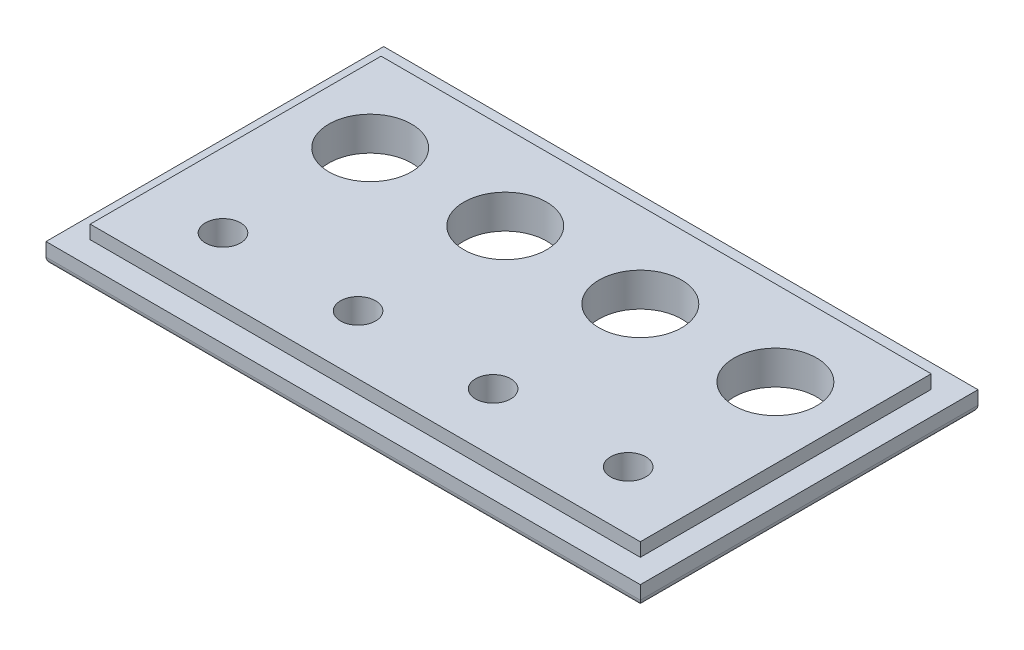
ISO-10303-21;
HEADER;
FILE_DESCRIPTION(('STEP AP214'),'2;1');
FILE_NAME('part.step','',(''),(''),'','','');
FILE_SCHEMA(('AUTOMOTIVE_DESIGN { 1 0 10303 214 1 1 1 1 }'));
ENDSEC;
DATA;
#1=APPLICATION_CONTEXT('core data for automotive mechanical design processes');
#2=APPLICATION_PROTOCOL_DEFINITION('international standard','automotive_design',2000,#1);
#3=PRODUCT_CONTEXT('',#1,'mechanical');
#4=PRODUCT('Part','Part','',(#3));
#5=PRODUCT_RELATED_PRODUCT_CATEGORY('part','',(#4));
#6=PRODUCT_DEFINITION_FORMATION('','',#4);
#7=PRODUCT_DEFINITION_CONTEXT('part definition',#1,'design');
#8=PRODUCT_DEFINITION('design','',#6,#7);
#9=PRODUCT_DEFINITION_SHAPE('','',#8);
#10=(LENGTH_UNIT() NAMED_UNIT(*) SI_UNIT(.MILLI.,.METRE.));
#11=(NAMED_UNIT(*) PLANE_ANGLE_UNIT() SI_UNIT($,.RADIAN.));
#12=(NAMED_UNIT(*) SI_UNIT($,.STERADIAN.) SOLID_ANGLE_UNIT());
#13=UNCERTAINTY_MEASURE_WITH_UNIT(LENGTH_MEASURE(1.E-05),#10,'distance_accuracy_value','');
#14=(GEOMETRIC_REPRESENTATION_CONTEXT(3) GLOBAL_UNCERTAINTY_ASSIGNED_CONTEXT((#13)) GLOBAL_UNIT_ASSIGNED_CONTEXT((#10,
#11,#12)) REPRESENTATION_CONTEXT('',''));
#15=CARTESIAN_POINT('',(0.,0.,0.));
#16=DIRECTION('',(0.,0.,1.));
#17=DIRECTION('',(1.,0.,0.));
#18=AXIS2_PLACEMENT_3D('',#15,#16,#17);
#19=CARTESIAN_POINT('',(44.,3.,0.));
#20=DIRECTION('',(1.,0.,0.));
#21=DIRECTION('',(0.,0.,-1.));
#22=AXIS2_PLACEMENT_3D('',#19,#20,#21);
#23=PLANE('',#22);
#24=DIRECTION('',(0.,-1.,0.));
#25=VECTOR('',#24,1.);
#26=CARTESIAN_POINT('',(44.,3.,0.));
#27=LINE('',#26,#25);
#28=CARTESIAN_POINT('',(44.,3.,0.));
#29=VERTEX_POINT('',#28);
#30=CARTESIAN_POINT('',(44.,1.,0.));
#31=VERTEX_POINT('',#30);
#32=EDGE_CURVE('E174',#29,#31,#27,.T.);
#33=ORIENTED_EDGE('',*,*,#32,.T.);
#34=DIRECTION('',(0.,0.,1.));
#35=VECTOR('',#34,1.);
#36=CARTESIAN_POINT('',(44.,1.,-50.));
#37=LINE('',#36,#35);
#38=CARTESIAN_POINT('',(44.,1.,-50.));
#39=VERTEX_POINT('',#38);
#40=EDGE_CURVE('E72',#31,#39,#37,.F.);
#41=ORIENTED_EDGE('',*,*,#40,.T.);
#42=DIRECTION('',(0.,-1.,0.));
#43=VECTOR('',#42,1.);
#44=CARTESIAN_POINT('',(44.,3.,-50.));
#45=LINE('',#44,#43);
#46=CARTESIAN_POINT('',(44.,3.,-50.));
#47=VERTEX_POINT('',#46);
#48=EDGE_CURVE('E184',#47,#39,#45,.T.);
#49=ORIENTED_EDGE('',*,*,#48,.F.);
#50=DIRECTION('',(0.,0.,1.));
#51=VECTOR('',#50,1.);
#52=CARTESIAN_POINT('',(44.,3.,0.));
#53=LINE('',#52,#51);
#54=EDGE_CURVE('E154',#47,#29,#53,.T.);
#55=ORIENTED_EDGE('',*,*,#54,.T.);
#56=EDGE_LOOP('',(#33,#41,#49,#55));
#57=FACE_BOUND('',#56,.T.);
#58=ADVANCED_FACE('F47',(#57),#23,.T.);
#59=CARTESIAN_POINT('',(0.,3.,-50.));
#60=DIRECTION('',(0.,0.,-1.));
#61=DIRECTION('',(-1.,0.,0.));
#62=AXIS2_PLACEMENT_3D('',#59,#60,#61);
#63=PLANE('',#62);
#64=ORIENTED_EDGE('',*,*,#48,.T.);
#65=DIRECTION('',(1.,0.,0.));
#66=VECTOR('',#65,1.);
#67=CARTESIAN_POINT('',(-44.,1.,-50.));
#68=LINE('',#67,#66);
#69=CARTESIAN_POINT('',(-44.,1.,-50.));
#70=VERTEX_POINT('',#69);
#71=EDGE_CURVE('E57',#39,#70,#68,.F.);
#72=ORIENTED_EDGE('',*,*,#71,.T.);
#73=DIRECTION('',(0.,-1.,0.));
#74=VECTOR('',#73,1.);
#75=CARTESIAN_POINT('',(-44.,3.,-50.));
#76=LINE('',#75,#74);
#77=CARTESIAN_POINT('',(-44.,3.,-50.));
#78=VERTEX_POINT('',#77);
#79=EDGE_CURVE('E181',#78,#70,#76,.T.);
#80=ORIENTED_EDGE('',*,*,#79,.F.);
#81=DIRECTION('',(1.,0.,0.));
#82=VECTOR('',#81,1.);
#83=CARTESIAN_POINT('',(0.,3.,-50.));
#84=LINE('',#83,#82);
#85=EDGE_CURVE('E159',#78,#47,#84,.T.);
#86=ORIENTED_EDGE('',*,*,#85,.T.);
#87=EDGE_LOOP('',(#64,#72,#80,#86));
#88=FACE_BOUND('',#87,.T.);
#89=ADVANCED_FACE('F317',(#88),#63,.T.);
#90=CARTESIAN_POINT('',(-44.,3.,0.));
#91=DIRECTION('',(1.,0.,0.));
#92=DIRECTION('',(0.,0.,-1.));
#93=AXIS2_PLACEMENT_3D('',#90,#91,#92);
#94=PLANE('',#93);
#95=ORIENTED_EDGE('',*,*,#79,.T.);
#96=DIRECTION('',(0.,0.,1.));
#97=VECTOR('',#96,1.);
#98=CARTESIAN_POINT('',(-44.,1.,0.));
#99=LINE('',#98,#97);
#100=CARTESIAN_POINT('',(-44.,1.,0.));
#101=VERTEX_POINT('',#100);
#102=EDGE_CURVE('E11',#70,#101,#99,.T.);
#103=ORIENTED_EDGE('',*,*,#102,.T.);
#104=DIRECTION('',(0.,-1.,0.));
#105=VECTOR('',#104,1.);
#106=CARTESIAN_POINT('',(-44.,3.,0.));
#107=LINE('',#106,#105);
#108=CARTESIAN_POINT('',(-44.,3.,0.));
#109=VERTEX_POINT('',#108);
#110=EDGE_CURVE('E177',#109,#101,#107,.T.);
#111=ORIENTED_EDGE('',*,*,#110,.F.);
#112=DIRECTION('',(0.,0.,1.));
#113=VECTOR('',#112,1.);
#114=CARTESIAN_POINT('',(-44.,3.,0.));
#115=LINE('',#114,#113);
#116=EDGE_CURVE('E168',#78,#109,#115,.T.);
#117=ORIENTED_EDGE('',*,*,#116,.F.);
#118=EDGE_LOOP('',(#95,#103,#111,#117));
#119=FACE_BOUND('',#118,.T.);
#120=ADVANCED_FACE('F321',(#119),#94,.F.);
#121=CARTESIAN_POINT('',(0.,3.,0.));
#122=DIRECTION('',(0.,0.,-1.));
#123=DIRECTION('',(-1.,0.,0.));
#124=AXIS2_PLACEMENT_3D('',#121,#122,#123);
#125=PLANE('',#124);
#126=ORIENTED_EDGE('',*,*,#110,.T.);
#127=DIRECTION('',(1.,0.,0.));
#128=VECTOR('',#127,1.);
#129=CARTESIAN_POINT('',(0.,1.,0.));
#130=LINE('',#129,#128);
#131=EDGE_CURVE('E187',#101,#31,#130,.T.);
#132=ORIENTED_EDGE('',*,*,#131,.T.);
#133=ORIENTED_EDGE('',*,*,#32,.F.);
#134=DIRECTION('',(1.,0.,0.));
#135=VECTOR('',#134,1.);
#136=CARTESIAN_POINT('',(0.,3.,0.));
#137=LINE('',#136,#135);
#138=EDGE_CURVE('E171',#109,#29,#137,.T.);
#139=ORIENTED_EDGE('',*,*,#138,.F.);
#140=EDGE_LOOP('',(#126,#132,#133,#139));
#141=FACE_BOUND('',#140,.T.);
#142=ADVANCED_FACE('F311',(#141),#125,.F.);
#143=CARTESIAN_POINT('',(0.,3.,0.));
#144=DIRECTION('',(0.,1.,0.));
#145=DIRECTION('',(0.,0.,1.));
#146=AXIS2_PLACEMENT_3D('',#143,#144,#145);
#147=PLANE('',#146);
#148=DIRECTION('',(0.,0.,-1.));
#149=VECTOR('',#148,1.);
#150=CARTESIAN_POINT('',(40.5,3.,-46.573471676949));
#151=LINE('',#150,#149);
#152=CARTESIAN_POINT('',(40.5,3.,-3.5));
#153=VERTEX_POINT('',#152);
#154=CARTESIAN_POINT('',(40.5,3.,-46.573471676949));
#155=VERTEX_POINT('',#154);
#156=EDGE_CURVE('E152',#153,#155,#151,.T.);
#157=ORIENTED_EDGE('',*,*,#156,.F.);
#158=DIRECTION('',(1.,0.,0.));
#159=VECTOR('',#158,1.);
#160=CARTESIAN_POINT('',(-40.9566130261587,3.,-3.5));
#161=LINE('',#160,#159);
#162=CARTESIAN_POINT('',(-40.9566130261587,3.,-3.5));
#163=VERTEX_POINT('',#162);
#164=EDGE_CURVE('E149',#163,#153,#161,.T.);
#165=ORIENTED_EDGE('',*,*,#164,.F.);
#166=DIRECTION('',(0.,0.,1.));
#167=VECTOR('',#166,1.);
#168=CARTESIAN_POINT('',(-40.9566130261587,3.,-46.573471676949));
#169=LINE('',#168,#167);
#170=CARTESIAN_POINT('',(-40.9566130261587,3.,-46.573471676949));
#171=VERTEX_POINT('',#170);
#172=EDGE_CURVE('E291',#171,#163,#169,.T.);
#173=ORIENTED_EDGE('',*,*,#172,.F.);
#174=DIRECTION('',(-1.,0.,0.));
#175=VECTOR('',#174,1.);
#176=CARTESIAN_POINT('',(-40.9566130261587,3.,-46.573471676949));
#177=LINE('',#176,#175);
#178=EDGE_CURVE('E288',#155,#171,#177,.T.);
#179=ORIENTED_EDGE('',*,*,#178,.F.);
#180=EDGE_LOOP('',(#157,#165,#173,#179));
#181=FACE_BOUND('',#180,.T.);
#182=ORIENTED_EDGE('',*,*,#54,.F.);
#183=ORIENTED_EDGE('',*,*,#85,.F.);
#184=ORIENTED_EDGE('',*,*,#116,.T.);
#185=ORIENTED_EDGE('',*,*,#138,.T.);
#186=EDGE_LOOP('',(#182,#183,#184,#185));
#187=FACE_BOUND('',#186,.T.);
#188=ADVANCED_FACE('F307',(#181,#187),#147,.T.);
#189=CARTESIAN_POINT('',(0.,0.,0.));
#190=DIRECTION('',(0.,1.,0.));
#191=DIRECTION('',(0.,0.,1.));
#192=AXIS2_PLACEMENT_3D('',#189,#190,#191);
#193=PLANE('',#192);
#194=DIRECTION('',(0.,0.,1.));
#195=VECTOR('',#194,1.);
#196=CARTESIAN_POINT('',(43.,0.,0.));
#197=LINE('',#196,#195);
#198=CARTESIAN_POINT('',(43.,0.,-49.));
#199=VERTEX_POINT('',#198);
#200=CARTESIAN_POINT('',(43.,0.,-1.));
#201=VERTEX_POINT('',#200);
#202=EDGE_CURVE('E197',#199,#201,#197,.T.);
#203=ORIENTED_EDGE('',*,*,#202,.T.);
#204=DIRECTION('',(1.,0.,0.));
#205=VECTOR('',#204,1.);
#206=CARTESIAN_POINT('',(0.,0.,-1.));
#207=LINE('',#206,#205);
#208=CARTESIAN_POINT('',(-43.,0.,-1.));
#209=VERTEX_POINT('',#208);
#210=EDGE_CURVE('E200',#201,#209,#207,.F.);
#211=ORIENTED_EDGE('',*,*,#210,.T.);
#212=DIRECTION('',(0.,0.,1.));
#213=VECTOR('',#212,1.);
#214=CARTESIAN_POINT('',(-43.,0.,0.));
#215=LINE('',#214,#213);
#216=CARTESIAN_POINT('',(-43.,0.,-49.));
#217=VERTEX_POINT('',#216);
#218=EDGE_CURVE('E191',#209,#217,#215,.F.);
#219=ORIENTED_EDGE('',*,*,#218,.T.);
#220=DIRECTION('',(1.,0.,0.));
#221=VECTOR('',#220,1.);
#222=CARTESIAN_POINT('',(44.,0.,-49.));
#223=LINE('',#222,#221);
#224=EDGE_CURVE('E194',#217,#199,#223,.T.);
#225=ORIENTED_EDGE('',*,*,#224,.T.);
#226=EDGE_LOOP('',(#203,#211,#219,#225));
#227=FACE_BOUND('',#226,.T.);
#228=CARTESIAN_POINT('',(30.,0.,-12.2068107626156));
#229=DIRECTION('',(0.,1.,0.));
#230=DIRECTION('',(0.,0.,1.));
#231=AXIS2_PLACEMENT_3D('',#228,#229,#230);
#232=CIRCLE('',#231,2.6);
#233=CARTESIAN_POINT('',(30.,0.,-9.60681076261557));
#234=VERTEX_POINT('',#233);
#235=EDGE_CURVE('E245',#234,#234,#232,.T.);
#236=ORIENTED_EDGE('',*,*,#235,.T.);
#237=EDGE_LOOP('',(#236));
#238=FACE_BOUND('',#237,.T.);
#239=CARTESIAN_POINT('',(-30.,0.,-34.));
#240=DIRECTION('',(0.,1.,0.));
#241=DIRECTION('',(0.,0.,1.));
#242=AXIS2_PLACEMENT_3D('',#239,#240,#241);
#243=CIRCLE('',#242,6.12499999999999);
#244=CARTESIAN_POINT('',(-30.,0.,-27.875));
#245=VERTEX_POINT('',#244);
#246=EDGE_CURVE('E244',#245,#245,#243,.T.);
#247=ORIENTED_EDGE('',*,*,#246,.T.);
#248=EDGE_LOOP('',(#247));
#249=FACE_BOUND('',#248,.T.);
#250=CARTESIAN_POINT('',(-9.99999999999999,0.,-34.));
#251=DIRECTION('',(0.,1.,0.));
#252=DIRECTION('',(0.,0.,1.));
#253=AXIS2_PLACEMENT_3D('',#250,#251,#252);
#254=CIRCLE('',#253,6.125);
#255=CARTESIAN_POINT('',(-9.99999999999999,0.,-27.875));
#256=VERTEX_POINT('',#255);
#257=EDGE_CURVE('E263',#256,#256,#254,.T.);
#258=ORIENTED_EDGE('',*,*,#257,.T.);
#259=EDGE_LOOP('',(#258));
#260=FACE_BOUND('',#259,.T.);
#261=CARTESIAN_POINT('',(10.,0.,-34.));
#262=DIRECTION('',(0.,1.,0.));
#263=DIRECTION('',(0.,0.,1.));
#264=AXIS2_PLACEMENT_3D('',#261,#262,#263);
#265=CIRCLE('',#264,6.125);
#266=CARTESIAN_POINT('',(10.,0.,-27.875));
#267=VERTEX_POINT('',#266);
#268=EDGE_CURVE('E262',#267,#267,#265,.T.);
#269=ORIENTED_EDGE('',*,*,#268,.T.);
#270=EDGE_LOOP('',(#269));
#271=FACE_BOUND('',#270,.T.);
#272=CARTESIAN_POINT('',(10.,0.,-12.2068107626156));
#273=DIRECTION('',(0.,1.,0.));
#274=DIRECTION('',(0.,0.,1.));
#275=AXIS2_PLACEMENT_3D('',#272,#273,#274);
#276=CIRCLE('',#275,2.6);
#277=CARTESIAN_POINT('',(10.,0.,-9.60681076261557));
#278=VERTEX_POINT('',#277);
#279=EDGE_CURVE('E254',#278,#278,#276,.T.);
#280=ORIENTED_EDGE('',*,*,#279,.T.);
#281=EDGE_LOOP('',(#280));
#282=FACE_BOUND('',#281,.T.);
#283=CARTESIAN_POINT('',(-9.99999999999999,0.,-12.2068107626156));
#284=DIRECTION('',(0.,1.,0.));
#285=DIRECTION('',(0.,0.,1.));
#286=AXIS2_PLACEMENT_3D('',#283,#284,#285);
#287=CIRCLE('',#286,2.6);
#288=CARTESIAN_POINT('',(-9.99999999999999,0.,-9.60681076261557));
#289=VERTEX_POINT('',#288);
#290=EDGE_CURVE('E237',#289,#289,#287,.T.);
#291=ORIENTED_EDGE('',*,*,#290,.T.);
#292=EDGE_LOOP('',(#291));
#293=FACE_BOUND('',#292,.T.);
#294=CARTESIAN_POINT('',(-30.,0.,-12.2068107626156));
#295=DIRECTION('',(0.,1.,0.));
#296=DIRECTION('',(0.,0.,1.));
#297=AXIS2_PLACEMENT_3D('',#294,#295,#296);
#298=CIRCLE('',#297,2.6);
#299=CARTESIAN_POINT('',(-30.,0.,-9.60681076261557));
#300=VERTEX_POINT('',#299);
#301=EDGE_CURVE('E228',#300,#300,#298,.T.);
#302=ORIENTED_EDGE('',*,*,#301,.T.);
#303=EDGE_LOOP('',(#302));
#304=FACE_BOUND('',#303,.T.);
#305=CARTESIAN_POINT('',(30.,0.,-34.));
#306=DIRECTION('',(0.,1.,0.));
#307=DIRECTION('',(0.,0.,1.));
#308=AXIS2_PLACEMENT_3D('',#305,#306,#307);
#309=CIRCLE('',#308,6.125);
#310=CARTESIAN_POINT('',(30.,0.,-27.875));
#311=VERTEX_POINT('',#310);
#312=EDGE_CURVE('E267',#311,#311,#309,.T.);
#313=ORIENTED_EDGE('',*,*,#312,.T.);
#314=EDGE_LOOP('',(#313));
#315=FACE_BOUND('',#314,.T.);
#316=ADVANCED_FACE('F310',(#227,#238,#249,#260,#271,#282,#293,#304,#315),#193,.F.);
#317=CARTESIAN_POINT('',(40.5,5.,-46.573471676949));
#318=DIRECTION('',(-1.,0.,0.));
#319=DIRECTION('',(0.,0.,1.));
#320=AXIS2_PLACEMENT_3D('',#317,#318,#319);
#321=PLANE('',#320);
#322=ORIENTED_EDGE('',*,*,#156,.T.);
#323=DIRECTION('',(0.,-1.,0.));
#324=VECTOR('',#323,1.);
#325=CARTESIAN_POINT('',(40.5,5.,-46.573471676949));
#326=LINE('',#325,#324);
#327=CARTESIAN_POINT('',(40.5,5.,-46.573471676949));
#328=VERTEX_POINT('',#327);
#329=EDGE_CURVE('E131',#328,#155,#326,.T.);
#330=ORIENTED_EDGE('',*,*,#329,.F.);
#331=DIRECTION('',(0.,0.,-1.));
#332=VECTOR('',#331,1.);
#333=CARTESIAN_POINT('',(40.5,5.,-46.573471676949));
#334=LINE('',#333,#332);
#335=CARTESIAN_POINT('',(40.5,5.,-3.5));
#336=VERTEX_POINT('',#335);
#337=EDGE_CURVE('E139',#336,#328,#334,.T.);
#338=ORIENTED_EDGE('',*,*,#337,.F.);
#339=DIRECTION('',(0.,-1.,0.));
#340=VECTOR('',#339,1.);
#341=CARTESIAN_POINT('',(40.5,5.,-3.5));
#342=LINE('',#341,#340);
#343=EDGE_CURVE('E285',#336,#153,#342,.T.);
#344=ORIENTED_EDGE('',*,*,#343,.T.);
#345=EDGE_LOOP('',(#322,#330,#338,#344));
#346=FACE_BOUND('',#345,.T.);
#347=ADVANCED_FACE('F151',(#346),#321,.F.);
#348=CARTESIAN_POINT('',(-40.9566130261587,5.,-46.573471676949));
#349=DIRECTION('',(0.,0.,1.));
#350=DIRECTION('',(1.,0.,0.));
#351=AXIS2_PLACEMENT_3D('',#348,#349,#350);
#352=PLANE('',#351);
#353=ORIENTED_EDGE('',*,*,#178,.T.);
#354=DIRECTION('',(0.,-1.,0.));
#355=VECTOR('',#354,1.);
#356=CARTESIAN_POINT('',(-40.9566130261587,5.,-46.573471676949));
#357=LINE('',#356,#355);
#358=CARTESIAN_POINT('',(-40.9566130261587,5.,-46.573471676949));
#359=VERTEX_POINT('',#358);
#360=EDGE_CURVE('E134',#359,#171,#357,.T.);
#361=ORIENTED_EDGE('',*,*,#360,.F.);
#362=DIRECTION('',(-1.,0.,0.));
#363=VECTOR('',#362,1.);
#364=CARTESIAN_POINT('',(-40.9566130261587,5.,-46.573471676949));
#365=LINE('',#364,#363);
#366=EDGE_CURVE('E126',#328,#359,#365,.T.);
#367=ORIENTED_EDGE('',*,*,#366,.F.);
#368=ORIENTED_EDGE('',*,*,#329,.T.);
#369=EDGE_LOOP('',(#353,#361,#367,#368));
#370=FACE_BOUND('',#369,.T.);
#371=ADVANCED_FACE('F129',(#370),#352,.F.);
#372=CARTESIAN_POINT('',(-40.9566130261587,5.,-46.573471676949));
#373=DIRECTION('',(1.,0.,0.));
#374=DIRECTION('',(0.,0.,-1.));
#375=AXIS2_PLACEMENT_3D('',#372,#373,#374);
#376=PLANE('',#375);
#377=ORIENTED_EDGE('',*,*,#172,.T.);
#378=DIRECTION('',(0.,-1.,0.));
#379=VECTOR('',#378,1.);
#380=CARTESIAN_POINT('',(-40.9566130261587,5.,-3.5));
#381=LINE('',#380,#379);
#382=CARTESIAN_POINT('',(-40.9566130261587,5.,-3.5));
#383=VERTEX_POINT('',#382);
#384=EDGE_CURVE('E161',#383,#163,#381,.T.);
#385=ORIENTED_EDGE('',*,*,#384,.F.);
#386=DIRECTION('',(0.,0.,1.));
#387=VECTOR('',#386,1.);
#388=CARTESIAN_POINT('',(-40.9566130261587,5.,-46.573471676949));
#389=LINE('',#388,#387);
#390=EDGE_CURVE('E138',#359,#383,#389,.T.);
#391=ORIENTED_EDGE('',*,*,#390,.F.);
#392=ORIENTED_EDGE('',*,*,#360,.T.);
#393=EDGE_LOOP('',(#377,#385,#391,#392));
#394=FACE_BOUND('',#393,.T.);
#395=ADVANCED_FACE('F305',(#394),#376,.F.);
#396=CARTESIAN_POINT('',(-40.9566130261587,5.,-3.5));
#397=DIRECTION('',(0.,0.,-1.));
#398=DIRECTION('',(-1.,0.,0.));
#399=AXIS2_PLACEMENT_3D('',#396,#397,#398);
#400=PLANE('',#399);
#401=ORIENTED_EDGE('',*,*,#164,.T.);
#402=ORIENTED_EDGE('',*,*,#343,.F.);
#403=DIRECTION('',(1.,0.,0.));
#404=VECTOR('',#403,1.);
#405=CARTESIAN_POINT('',(-40.9566130261587,5.,-3.5));
#406=LINE('',#405,#404);
#407=EDGE_CURVE('E144',#383,#336,#406,.T.);
#408=ORIENTED_EDGE('',*,*,#407,.F.);
#409=ORIENTED_EDGE('',*,*,#384,.T.);
#410=EDGE_LOOP('',(#401,#402,#408,#409));
#411=FACE_BOUND('',#410,.T.);
#412=ADVANCED_FACE('F303',(#411),#400,.F.);
#413=CARTESIAN_POINT('',(0.,5.,0.));
#414=DIRECTION('',(0.,1.,0.));
#415=DIRECTION('',(0.,0.,1.));
#416=AXIS2_PLACEMENT_3D('',#413,#414,#415);
#417=PLANE('',#416);
#418=CARTESIAN_POINT('',(30.,5.,-12.2068107626156));
#419=DIRECTION('',(0.,1.,0.));
#420=DIRECTION('',(0.,0.,1.));
#421=AXIS2_PLACEMENT_3D('',#418,#419,#420);
#422=CIRCLE('',#421,2.6);
#423=CARTESIAN_POINT('',(30.,5.,-9.60681076261557));
#424=VERTEX_POINT('',#423);
#425=EDGE_CURVE('E250',#424,#424,#422,.T.);
#426=ORIENTED_EDGE('',*,*,#425,.F.);
#427=EDGE_LOOP('',(#426));
#428=FACE_BOUND('',#427,.T.);
#429=CARTESIAN_POINT('',(-30.,5.,-34.));
#430=DIRECTION('',(0.,1.,0.));
#431=DIRECTION('',(0.,0.,1.));
#432=AXIS2_PLACEMENT_3D('',#429,#430,#431);
#433=CIRCLE('',#432,6.12499999999999);
#434=CARTESIAN_POINT('',(-30.,5.,-27.875));
#435=VERTEX_POINT('',#434);
#436=EDGE_CURVE('E240',#435,#435,#433,.T.);
#437=ORIENTED_EDGE('',*,*,#436,.F.);
#438=EDGE_LOOP('',(#437));
#439=FACE_BOUND('',#438,.T.);
#440=CARTESIAN_POINT('',(-9.99999999999999,5.,-34.));
#441=DIRECTION('',(0.,1.,0.));
#442=DIRECTION('',(0.,0.,1.));
#443=AXIS2_PLACEMENT_3D('',#440,#441,#442);
#444=CIRCLE('',#443,6.125);
#445=CARTESIAN_POINT('',(-9.99999999999999,5.,-27.875));
#446=VERTEX_POINT('',#445);
#447=EDGE_CURVE('E249',#446,#446,#444,.T.);
#448=ORIENTED_EDGE('',*,*,#447,.F.);
#449=EDGE_LOOP('',(#448));
#450=FACE_BOUND('',#449,.T.);
#451=CARTESIAN_POINT('',(10.,5.,-34.));
#452=DIRECTION('',(0.,1.,0.));
#453=DIRECTION('',(0.,0.,1.));
#454=AXIS2_PLACEMENT_3D('',#451,#452,#453);
#455=CIRCLE('',#454,6.125);
#456=CARTESIAN_POINT('',(10.,5.,-27.875));
#457=VERTEX_POINT('',#456);
#458=EDGE_CURVE('E258',#457,#457,#455,.T.);
#459=ORIENTED_EDGE('',*,*,#458,.F.);
#460=EDGE_LOOP('',(#459));
#461=FACE_BOUND('',#460,.T.);
#462=CARTESIAN_POINT('',(10.,5.,-12.2068107626156));
#463=DIRECTION('',(0.,1.,0.));
#464=DIRECTION('',(0.,0.,1.));
#465=AXIS2_PLACEMENT_3D('',#462,#463,#464);
#466=CIRCLE('',#465,2.6);
#467=CARTESIAN_POINT('',(10.,5.,-9.60681076261557));
#468=VERTEX_POINT('',#467);
#469=EDGE_CURVE('E548',#468,#468,#466,.T.);
#470=ORIENTED_EDGE('',*,*,#469,.F.);
#471=EDGE_LOOP('',(#470));
#472=FACE_BOUND('',#471,.T.);
#473=CARTESIAN_POINT('',(-9.99999999999999,5.,-12.2068107626156));
#474=DIRECTION('',(0.,1.,0.));
#475=DIRECTION('',(0.,0.,1.));
#476=AXIS2_PLACEMENT_3D('',#473,#474,#475);
#477=CIRCLE('',#476,2.6);
#478=CARTESIAN_POINT('',(-9.99999999999999,5.,-9.60681076261557));
#479=VERTEX_POINT('',#478);
#480=EDGE_CURVE('E234',#479,#479,#477,.T.);
#481=ORIENTED_EDGE('',*,*,#480,.F.);
#482=EDGE_LOOP('',(#481));
#483=FACE_BOUND('',#482,.T.);
#484=CARTESIAN_POINT('',(-30.,5.,-12.2068107626156));
#485=DIRECTION('',(0.,1.,0.));
#486=DIRECTION('',(0.,0.,1.));
#487=AXIS2_PLACEMENT_3D('',#484,#485,#486);
#488=CIRCLE('',#487,2.6);
#489=CARTESIAN_POINT('',(-30.,5.,-9.60681076261557));
#490=VERTEX_POINT('',#489);
#491=EDGE_CURVE('E221',#490,#490,#488,.T.);
#492=ORIENTED_EDGE('',*,*,#491,.F.);
#493=EDGE_LOOP('',(#492));
#494=FACE_BOUND('',#493,.T.);
#495=CARTESIAN_POINT('',(30.,5.,-34.));
#496=DIRECTION('',(0.,1.,0.));
#497=DIRECTION('',(0.,0.,1.));
#498=AXIS2_PLACEMENT_3D('',#495,#496,#497);
#499=CIRCLE('',#498,6.125);
#500=CARTESIAN_POINT('',(30.,5.,-27.875));
#501=VERTEX_POINT('',#500);
#502=EDGE_CURVE('E277',#501,#501,#499,.T.);
#503=ORIENTED_EDGE('',*,*,#502,.F.);
#504=EDGE_LOOP('',(#503));
#505=FACE_BOUND('',#504,.T.);
#506=ORIENTED_EDGE('',*,*,#337,.T.);
#507=ORIENTED_EDGE('',*,*,#366,.T.);
#508=ORIENTED_EDGE('',*,*,#390,.T.);
#509=ORIENTED_EDGE('',*,*,#407,.T.);
#510=EDGE_LOOP('',(#506,#507,#508,#509));
#511=FACE_BOUND('',#510,.T.);
#512=ADVANCED_FACE('F142',(#428,#439,#450,#461,#472,#483,#494,#505,#511),#417,.T.);
#513=CARTESIAN_POINT('',(30.,5.,-34.));
#514=DIRECTION('',(0.,-1.,0.));
#515=DIRECTION('',(0.,0.,-1.));
#516=AXIS2_PLACEMENT_3D('',#513,#514,#515);
#517=CYLINDRICAL_SURFACE('',#516,6.125);
#518=ORIENTED_EDGE('',*,*,#502,.T.);
#519=EDGE_LOOP('',(#518));
#520=FACE_BOUND('',#519,.T.);
#521=ORIENTED_EDGE('',*,*,#312,.F.);
#522=EDGE_LOOP('',(#521));
#523=FACE_BOUND('',#522,.T.);
#524=ADVANCED_FACE('F377',(#520,#523),#517,.F.);
#525=CARTESIAN_POINT('',(-30.,5.,-12.2068107626156));
#526=DIRECTION('',(0.,-1.,0.));
#527=DIRECTION('',(0.,0.,-1.));
#528=AXIS2_PLACEMENT_3D('',#525,#526,#527);
#529=CYLINDRICAL_SURFACE('',#528,2.6);
#530=ORIENTED_EDGE('',*,*,#491,.T.);
#531=EDGE_LOOP('',(#530));
#532=FACE_BOUND('',#531,.T.);
#533=ORIENTED_EDGE('',*,*,#301,.F.);
#534=EDGE_LOOP('',(#533));
#535=FACE_BOUND('',#534,.T.);
#536=ADVANCED_FACE('F379',(#532,#535),#529,.F.);
#537=CARTESIAN_POINT('',(-9.99999999999999,5.,-12.2068107626156));
#538=DIRECTION('',(0.,-1.,0.));
#539=DIRECTION('',(0.,0.,-1.));
#540=AXIS2_PLACEMENT_3D('',#537,#538,#539);
#541=CYLINDRICAL_SURFACE('',#540,2.6);
#542=ORIENTED_EDGE('',*,*,#480,.T.);
#543=EDGE_LOOP('',(#542));
#544=FACE_BOUND('',#543,.T.);
#545=ORIENTED_EDGE('',*,*,#290,.F.);
#546=EDGE_LOOP('',(#545));
#547=FACE_BOUND('',#546,.T.);
#548=ADVANCED_FACE('F386',(#544,#547),#541,.F.);
#549=CARTESIAN_POINT('',(10.,5.,-12.2068107626156));
#550=DIRECTION('',(0.,-1.,0.));
#551=DIRECTION('',(0.,0.,-1.));
#552=AXIS2_PLACEMENT_3D('',#549,#550,#551);
#553=CYLINDRICAL_SURFACE('',#552,2.6);
#554=ORIENTED_EDGE('',*,*,#469,.T.);
#555=EDGE_LOOP('',(#554));
#556=FACE_BOUND('',#555,.T.);
#557=ORIENTED_EDGE('',*,*,#279,.F.);
#558=EDGE_LOOP('',(#557));
#559=FACE_BOUND('',#558,.T.);
#560=ADVANCED_FACE('F472',(#556,#559),#553,.F.);
#561=CARTESIAN_POINT('',(10.,5.,-34.));
#562=DIRECTION('',(0.,-1.,0.));
#563=DIRECTION('',(0.,0.,-1.));
#564=AXIS2_PLACEMENT_3D('',#561,#562,#563);
#565=CYLINDRICAL_SURFACE('',#564,6.125);
#566=ORIENTED_EDGE('',*,*,#458,.T.);
#567=EDGE_LOOP('',(#566));
#568=FACE_BOUND('',#567,.T.);
#569=ORIENTED_EDGE('',*,*,#268,.F.);
#570=EDGE_LOOP('',(#569));
#571=FACE_BOUND('',#570,.T.);
#572=ADVANCED_FACE('F482',(#568,#571),#565,.F.);
#573=CARTESIAN_POINT('',(-9.99999999999999,5.,-34.));
#574=DIRECTION('',(0.,-1.,0.));
#575=DIRECTION('',(0.,0.,-1.));
#576=AXIS2_PLACEMENT_3D('',#573,#574,#575);
#577=CYLINDRICAL_SURFACE('',#576,6.125);
#578=ORIENTED_EDGE('',*,*,#447,.T.);
#579=EDGE_LOOP('',(#578));
#580=FACE_BOUND('',#579,.T.);
#581=ORIENTED_EDGE('',*,*,#257,.F.);
#582=EDGE_LOOP('',(#581));
#583=FACE_BOUND('',#582,.T.);
#584=ADVANCED_FACE('F391',(#580,#583),#577,.F.);
#585=CARTESIAN_POINT('',(-30.,5.,-34.));
#586=DIRECTION('',(0.,-1.,0.));
#587=DIRECTION('',(0.,0.,-1.));
#588=AXIS2_PLACEMENT_3D('',#585,#586,#587);
#589=CYLINDRICAL_SURFACE('',#588,6.12499999999999);
#590=ORIENTED_EDGE('',*,*,#436,.T.);
#591=EDGE_LOOP('',(#590));
#592=FACE_BOUND('',#591,.T.);
#593=ORIENTED_EDGE('',*,*,#246,.F.);
#594=EDGE_LOOP('',(#593));
#595=FACE_BOUND('',#594,.T.);
#596=ADVANCED_FACE('F350',(#592,#595),#589,.F.);
#597=CARTESIAN_POINT('',(30.,5.,-12.2068107626156));
#598=DIRECTION('',(0.,-1.,0.));
#599=DIRECTION('',(0.,0.,-1.));
#600=AXIS2_PLACEMENT_3D('',#597,#598,#599);
#601=CYLINDRICAL_SURFACE('',#600,2.6);
#602=ORIENTED_EDGE('',*,*,#425,.T.);
#603=EDGE_LOOP('',(#602));
#604=FACE_BOUND('',#603,.T.);
#605=ORIENTED_EDGE('',*,*,#235,.F.);
#606=EDGE_LOOP('',(#605));
#607=FACE_BOUND('',#606,.T.);
#608=ADVANCED_FACE('F345',(#604,#607),#601,.F.);
#609=CARTESIAN_POINT('',(0.,1.,-49.));
#610=DIRECTION('',(-1.,0.,0.));
#611=DIRECTION('',(0.,0.,1.));
#612=AXIS2_PLACEMENT_3D('',#609,#610,#611);
#613=CYLINDRICAL_SURFACE('',#612,1.);
#614=CARTESIAN_POINT('',(43.,1.,-49.));
#615=DIRECTION('',(-0.707106781186547,0.,-0.707106781186547));
#616=DIRECTION('',(-0.707106781186547,0.,0.707106781186547));
#617=AXIS2_PLACEMENT_3D('',#614,#615,#616);
#618=ELLIPSE('',#617,1.41421356237309,1.);
#619=EDGE_CURVE('E213',#199,#39,#618,.F.);
#620=ORIENTED_EDGE('',*,*,#619,.F.);
#621=ORIENTED_EDGE('',*,*,#224,.F.);
#622=CARTESIAN_POINT('',(-43.,1.,-49.));
#623=DIRECTION('',(-0.707106781186547,0.,0.707106781186547));
#624=DIRECTION('',(0.707106781186547,0.,0.707106781186547));
#625=AXIS2_PLACEMENT_3D('',#622,#623,#624);
#626=ELLIPSE('',#625,1.41421356237309,1.);
#627=EDGE_CURVE('E51',#70,#217,#626,.T.);
#628=ORIENTED_EDGE('',*,*,#627,.F.);
#629=ORIENTED_EDGE('',*,*,#71,.F.);
#630=EDGE_LOOP('',(#620,#621,#628,#629));
#631=FACE_BOUND('',#630,.T.);
#632=ADVANCED_FACE('F49',(#631),#613,.T.);
#633=CARTESIAN_POINT('',(-43.,1.,0.));
#634=DIRECTION('',(0.,0.,1.));
#635=DIRECTION('',(1.,0.,0.));
#636=AXIS2_PLACEMENT_3D('',#633,#634,#635);
#637=CYLINDRICAL_SURFACE('',#636,1.);
#638=ORIENTED_EDGE('',*,*,#627,.T.);
#639=ORIENTED_EDGE('',*,*,#218,.F.);
#640=CARTESIAN_POINT('',(-43.,1.,-1.));
#641=DIRECTION('',(0.707106781186547,0.,0.707106781186547));
#642=DIRECTION('',(-0.707106781186547,0.,0.707106781186547));
#643=AXIS2_PLACEMENT_3D('',#640,#641,#642);
#644=ELLIPSE('',#643,1.41421356237309,1.);
#645=EDGE_CURVE('E211',#101,#209,#644,.T.);
#646=ORIENTED_EDGE('',*,*,#645,.F.);
#647=ORIENTED_EDGE('',*,*,#102,.F.);
#648=EDGE_LOOP('',(#638,#639,#646,#647));
#649=FACE_BOUND('',#648,.T.);
#650=ADVANCED_FACE('F340',(#649),#637,.T.);
#651=CARTESIAN_POINT('',(43.,1.,0.));
#652=DIRECTION('',(0.,0.,-1.));
#653=DIRECTION('',(-1.,0.,0.));
#654=AXIS2_PLACEMENT_3D('',#651,#652,#653);
#655=CYLINDRICAL_SURFACE('',#654,1.);
#656=ORIENTED_EDGE('',*,*,#619,.T.);
#657=ORIENTED_EDGE('',*,*,#40,.F.);
#658=CARTESIAN_POINT('',(43.,1.,-1.));
#659=DIRECTION('',(0.707106781186547,0.,-0.707106781186547));
#660=DIRECTION('',(-0.707106781186547,0.,-0.707106781186547));
#661=AXIS2_PLACEMENT_3D('',#658,#659,#660);
#662=ELLIPSE('',#661,1.41421356237309,1.);
#663=EDGE_CURVE('E208',#201,#31,#662,.F.);
#664=ORIENTED_EDGE('',*,*,#663,.F.);
#665=ORIENTED_EDGE('',*,*,#202,.F.);
#666=EDGE_LOOP('',(#656,#657,#664,#665));
#667=FACE_BOUND('',#666,.T.);
#668=ADVANCED_FACE('F337',(#667),#655,.T.);
#669=CARTESIAN_POINT('',(0.,1.,-1.));
#670=DIRECTION('',(1.,0.,0.));
#671=DIRECTION('',(0.,0.,-1.));
#672=AXIS2_PLACEMENT_3D('',#669,#670,#671);
#673=CYLINDRICAL_SURFACE('',#672,1.);
#674=ORIENTED_EDGE('',*,*,#645,.T.);
#675=ORIENTED_EDGE('',*,*,#210,.F.);
#676=ORIENTED_EDGE('',*,*,#663,.T.);
#677=ORIENTED_EDGE('',*,*,#131,.F.);
#678=EDGE_LOOP('',(#674,#675,#676,#677));
#679=FACE_BOUND('',#678,.T.);
#680=ADVANCED_FACE('F334',(#679),#673,.T.);
#681=CLOSED_SHELL('',(#58,#89,#120,#142,#188,#316,#347,#371,#395,#412,#512,#524,#536,#548,#560,
#572,#584,#596,#608,#632,#650,#668,#680));
#682=MANIFOLD_SOLID_BREP('B2',#681);
#683=ADVANCED_BREP_SHAPE_REPRESENTATION('',(#18,#682),#14);
#684=SHAPE_DEFINITION_REPRESENTATION(#9,#683);
ENDSEC;
END-ISO-10303-21;
